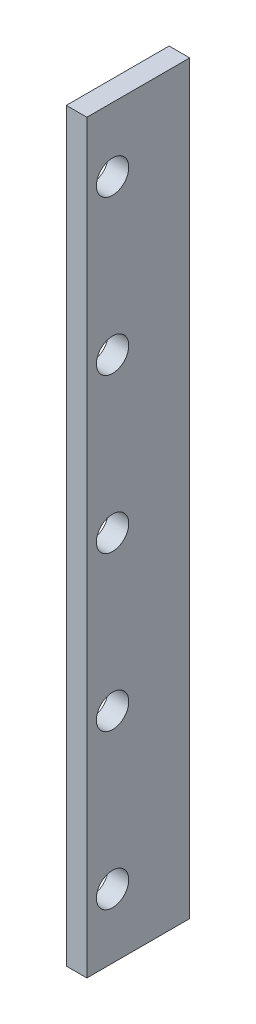
ISO-10303-21;
HEADER;
FILE_DESCRIPTION(('STEP AP214'),'2;1');
FILE_NAME('part.step','',(''),(''),'','','');
FILE_SCHEMA(('AUTOMOTIVE_DESIGN { 1 0 10303 214 1 1 1 1 }'));
ENDSEC;
DATA;
#1=APPLICATION_CONTEXT('core data for automotive mechanical design processes');
#2=APPLICATION_PROTOCOL_DEFINITION('international standard','automotive_design',2000,#1);
#3=PRODUCT_CONTEXT('',#1,'mechanical');
#4=PRODUCT('Part','Part','',(#3));
#5=PRODUCT_RELATED_PRODUCT_CATEGORY('part','',(#4));
#6=PRODUCT_DEFINITION_FORMATION('','',#4);
#7=PRODUCT_DEFINITION_CONTEXT('part definition',#1,'design');
#8=PRODUCT_DEFINITION('design','',#6,#7);
#9=PRODUCT_DEFINITION_SHAPE('','',#8);
#10=(LENGTH_UNIT() NAMED_UNIT(*) SI_UNIT(.MILLI.,.METRE.));
#11=(NAMED_UNIT(*) PLANE_ANGLE_UNIT() SI_UNIT($,.RADIAN.));
#12=(NAMED_UNIT(*) SI_UNIT($,.STERADIAN.) SOLID_ANGLE_UNIT());
#13=UNCERTAINTY_MEASURE_WITH_UNIT(LENGTH_MEASURE(1.E-05),#10,'distance_accuracy_value','');
#14=(GEOMETRIC_REPRESENTATION_CONTEXT(3) GLOBAL_UNCERTAINTY_ASSIGNED_CONTEXT((#13)) GLOBAL_UNIT_ASSIGNED_CONTEXT((#10,
#11,#12)) REPRESENTATION_CONTEXT('',''));
#15=CARTESIAN_POINT('',(0.,0.,0.));
#16=DIRECTION('',(0.,0.,1.));
#17=DIRECTION('',(1.,0.,0.));
#18=AXIS2_PLACEMENT_3D('',#15,#16,#17);
#19=CARTESIAN_POINT('',(0.,580.,-80.));
#20=DIRECTION('',(1.,0.,0.));
#21=DIRECTION('',(0.,0.,-1.));
#22=AXIS2_PLACEMENT_3D('',#19,#20,#21);
#23=PLANE('',#22);
#24=CARTESIAN_POINT('',(0.,530.,-20.0000000000017));
#25=DIRECTION('',(-1.,0.,0.));
#26=DIRECTION('',(0.,0.,1.));
#27=AXIS2_PLACEMENT_3D('',#24,#25,#26);
#28=CIRCLE('',#27,12.6);
#29=CARTESIAN_POINT('',(0.,530.,-7.40000000000167));
#30=VERTEX_POINT('',#29);
#31=EDGE_CURVE('E144',#30,#30,#28,.T.);
#32=ORIENTED_EDGE('',*,*,#31,.F.);
#33=EDGE_LOOP('',(#32));
#34=FACE_BOUND('',#33,.T.);
#35=CARTESIAN_POINT('',(0.,410.,-20.0000000000012));
#36=DIRECTION('',(-1.,0.,0.));
#37=DIRECTION('',(0.,0.,1.));
#38=AXIS2_PLACEMENT_3D('',#35,#36,#37);
#39=CIRCLE('',#38,12.6);
#40=CARTESIAN_POINT('',(0.,410.,-7.40000000000124));
#41=VERTEX_POINT('',#40);
#42=EDGE_CURVE('E152',#41,#41,#39,.T.);
#43=ORIENTED_EDGE('',*,*,#42,.F.);
#44=EDGE_LOOP('',(#43));
#45=FACE_BOUND('',#44,.T.);
#46=CARTESIAN_POINT('',(0.,290.,-20.0000000000008));
#47=DIRECTION('',(-1.,0.,0.));
#48=DIRECTION('',(0.,0.,1.));
#49=AXIS2_PLACEMENT_3D('',#46,#47,#48);
#50=CIRCLE('',#49,12.6);
#51=CARTESIAN_POINT('',(0.,290.,-7.40000000000083));
#52=VERTEX_POINT('',#51);
#53=EDGE_CURVE('E160',#52,#52,#50,.T.);
#54=ORIENTED_EDGE('',*,*,#53,.F.);
#55=EDGE_LOOP('',(#54));
#56=FACE_BOUND('',#55,.T.);
#57=CARTESIAN_POINT('',(0.,50.,-20.));
#58=DIRECTION('',(-1.,0.,0.));
#59=DIRECTION('',(0.,0.,1.));
#60=AXIS2_PLACEMENT_3D('',#57,#58,#59);
#61=CIRCLE('',#60,12.6);
#62=CARTESIAN_POINT('',(0.,50.,-7.40000000000001));
#63=VERTEX_POINT('',#62);
#64=EDGE_CURVE('E136',#63,#63,#61,.T.);
#65=ORIENTED_EDGE('',*,*,#64,.F.);
#66=EDGE_LOOP('',(#65));
#67=FACE_BOUND('',#66,.T.);
#68=CARTESIAN_POINT('',(0.,170.,-20.0000000000004));
#69=DIRECTION('',(-1.,0.,0.));
#70=DIRECTION('',(0.,0.,1.));
#71=AXIS2_PLACEMENT_3D('',#68,#69,#70);
#72=CIRCLE('',#71,12.6);
#73=CARTESIAN_POINT('',(0.,170.,-7.40000000000042));
#74=VERTEX_POINT('',#73);
#75=EDGE_CURVE('E132',#74,#74,#72,.T.);
#76=ORIENTED_EDGE('',*,*,#75,.F.);
#77=EDGE_LOOP('',(#76));
#78=FACE_BOUND('',#77,.T.);
#79=DIRECTION('',(0.,0.,1.));
#80=VECTOR('',#79,1.);
#81=CARTESIAN_POINT('',(0.,0.,-80.));
#82=LINE('',#81,#80);
#83=CARTESIAN_POINT('',(0.,0.,-80.));
#84=VERTEX_POINT('',#83);
#85=CARTESIAN_POINT('',(0.,0.,0.));
#86=VERTEX_POINT('',#85);
#87=EDGE_CURVE('E111',#84,#86,#82,.T.);
#88=ORIENTED_EDGE('',*,*,#87,.T.);
#89=DIRECTION('',(0.,-1.,0.));
#90=VECTOR('',#89,1.);
#91=CARTESIAN_POINT('',(0.,580.,0.));
#92=LINE('',#91,#90);
#93=CARTESIAN_POINT('',(0.,580.,0.));
#94=VERTEX_POINT('',#93);
#95=EDGE_CURVE('E11',#94,#86,#92,.T.);
#96=ORIENTED_EDGE('',*,*,#95,.F.);
#97=DIRECTION('',(0.,0.,1.));
#98=VECTOR('',#97,1.);
#99=CARTESIAN_POINT('',(0.,580.,-80.));
#100=LINE('',#99,#98);
#101=CARTESIAN_POINT('',(0.,580.,-80.));
#102=VERTEX_POINT('',#101);
#103=EDGE_CURVE('E95',#102,#94,#100,.T.);
#104=ORIENTED_EDGE('',*,*,#103,.F.);
#105=DIRECTION('',(0.,-1.,0.));
#106=VECTOR('',#105,1.);
#107=CARTESIAN_POINT('',(0.,580.,-80.));
#108=LINE('',#107,#106);
#109=EDGE_CURVE('E107',#102,#84,#108,.T.);
#110=ORIENTED_EDGE('',*,*,#109,.T.);
#111=EDGE_LOOP('',(#88,#96,#104,#110));
#112=FACE_BOUND('',#111,.T.);
#113=ADVANCED_FACE('F43',(#34,#45,#56,#67,#78,#112),#23,.F.);
#114=CARTESIAN_POINT('',(0.,580.,0.));
#115=DIRECTION('',(0.,0.,-1.));
#116=DIRECTION('',(-1.,0.,0.));
#117=AXIS2_PLACEMENT_3D('',#114,#115,#116);
#118=PLANE('',#117);
#119=DIRECTION('',(1.,0.,0.));
#120=VECTOR('',#119,1.);
#121=CARTESIAN_POINT('',(0.,0.,0.));
#122=LINE('',#121,#120);
#123=CARTESIAN_POINT('',(16.,0.,0.));
#124=VERTEX_POINT('',#123);
#125=EDGE_CURVE('E100',#86,#124,#122,.T.);
#126=ORIENTED_EDGE('',*,*,#125,.T.);
#127=DIRECTION('',(0.,-1.,0.));
#128=VECTOR('',#127,1.);
#129=CARTESIAN_POINT('',(16.,580.,0.));
#130=LINE('',#129,#128);
#131=CARTESIAN_POINT('',(16.,580.,0.));
#132=VERTEX_POINT('',#131);
#133=EDGE_CURVE('E52',#132,#124,#130,.T.);
#134=ORIENTED_EDGE('',*,*,#133,.F.);
#135=DIRECTION('',(1.,0.,0.));
#136=VECTOR('',#135,1.);
#137=CARTESIAN_POINT('',(0.,580.,0.));
#138=LINE('',#137,#136);
#139=EDGE_CURVE('E90',#94,#132,#138,.T.);
#140=ORIENTED_EDGE('',*,*,#139,.F.);
#141=ORIENTED_EDGE('',*,*,#95,.T.);
#142=EDGE_LOOP('',(#126,#134,#140,#141));
#143=FACE_BOUND('',#142,.T.);
#144=ADVANCED_FACE('F99',(#143),#118,.F.);
#145=CARTESIAN_POINT('',(16.,580.,0.));
#146=DIRECTION('',(-1.,0.,0.));
#147=DIRECTION('',(0.,0.,1.));
#148=AXIS2_PLACEMENT_3D('',#145,#146,#147);
#149=PLANE('',#148);
#150=CARTESIAN_POINT('',(16.,530.,-20.0000000000017));
#151=DIRECTION('',(-1.,0.,0.));
#152=DIRECTION('',(0.,0.,1.));
#153=AXIS2_PLACEMENT_3D('',#150,#151,#152);
#154=CIRCLE('',#153,12.6);
#155=CARTESIAN_POINT('',(16.,530.,-7.40000000000167));
#156=VERTEX_POINT('',#155);
#157=EDGE_CURVE('E140',#156,#156,#154,.T.);
#158=ORIENTED_EDGE('',*,*,#157,.T.);
#159=EDGE_LOOP('',(#158));
#160=FACE_BOUND('',#159,.T.);
#161=CARTESIAN_POINT('',(16.,410.,-20.0000000000012));
#162=DIRECTION('',(-1.,0.,0.));
#163=DIRECTION('',(0.,0.,1.));
#164=AXIS2_PLACEMENT_3D('',#161,#162,#163);
#165=CIRCLE('',#164,12.6);
#166=CARTESIAN_POINT('',(16.,410.,-7.40000000000124));
#167=VERTEX_POINT('',#166);
#168=EDGE_CURVE('E148',#167,#167,#165,.T.);
#169=ORIENTED_EDGE('',*,*,#168,.T.);
#170=EDGE_LOOP('',(#169));
#171=FACE_BOUND('',#170,.T.);
#172=CARTESIAN_POINT('',(16.,290.,-20.0000000000008));
#173=DIRECTION('',(-1.,0.,0.));
#174=DIRECTION('',(0.,0.,1.));
#175=AXIS2_PLACEMENT_3D('',#172,#173,#174);
#176=CIRCLE('',#175,12.6);
#177=CARTESIAN_POINT('',(16.,290.,-7.40000000000083));
#178=VERTEX_POINT('',#177);
#179=EDGE_CURVE('E156',#178,#178,#176,.T.);
#180=ORIENTED_EDGE('',*,*,#179,.T.);
#181=EDGE_LOOP('',(#180));
#182=FACE_BOUND('',#181,.T.);
#183=CARTESIAN_POINT('',(16.,50.,-20.));
#184=DIRECTION('',(-1.,0.,0.));
#185=DIRECTION('',(0.,0.,1.));
#186=AXIS2_PLACEMENT_3D('',#183,#184,#185);
#187=CIRCLE('',#186,12.6);
#188=CARTESIAN_POINT('',(16.,50.,-7.40000000000001));
#189=VERTEX_POINT('',#188);
#190=EDGE_CURVE('E164',#189,#189,#187,.T.);
#191=ORIENTED_EDGE('',*,*,#190,.T.);
#192=EDGE_LOOP('',(#191));
#193=FACE_BOUND('',#192,.T.);
#194=CARTESIAN_POINT('',(16.,170.,-20.0000000000004));
#195=DIRECTION('',(-1.,0.,0.));
#196=DIRECTION('',(0.,0.,1.));
#197=AXIS2_PLACEMENT_3D('',#194,#195,#196);
#198=CIRCLE('',#197,12.6);
#199=CARTESIAN_POINT('',(16.,170.,-7.40000000000042));
#200=VERTEX_POINT('',#199);
#201=EDGE_CURVE('E115',#200,#200,#198,.T.);
#202=ORIENTED_EDGE('',*,*,#201,.T.);
#203=EDGE_LOOP('',(#202));
#204=FACE_BOUND('',#203,.T.);
#205=DIRECTION('',(0.,0.,-1.));
#206=VECTOR('',#205,1.);
#207=CARTESIAN_POINT('',(16.,0.,0.));
#208=LINE('',#207,#206);
#209=CARTESIAN_POINT('',(16.,0.,-80.));
#210=VERTEX_POINT('',#209);
#211=EDGE_CURVE('E77',#124,#210,#208,.T.);
#212=ORIENTED_EDGE('',*,*,#211,.T.);
#213=DIRECTION('',(0.,-1.,0.));
#214=VECTOR('',#213,1.);
#215=CARTESIAN_POINT('',(16.,580.,-80.));
#216=LINE('',#215,#214);
#217=CARTESIAN_POINT('',(16.,580.,-80.));
#218=VERTEX_POINT('',#217);
#219=EDGE_CURVE('E102',#218,#210,#216,.T.);
#220=ORIENTED_EDGE('',*,*,#219,.F.);
#221=DIRECTION('',(0.,0.,-1.));
#222=VECTOR('',#221,1.);
#223=CARTESIAN_POINT('',(16.,580.,0.));
#224=LINE('',#223,#222);
#225=EDGE_CURVE('E93',#132,#218,#224,.T.);
#226=ORIENTED_EDGE('',*,*,#225,.F.);
#227=ORIENTED_EDGE('',*,*,#133,.T.);
#228=EDGE_LOOP('',(#212,#220,#226,#227));
#229=FACE_BOUND('',#228,.T.);
#230=ADVANCED_FACE('F103',(#160,#171,#182,#193,#204,#229),#149,.F.);
#231=CARTESIAN_POINT('',(16.,580.,-80.));
#232=DIRECTION('',(0.,0.,1.));
#233=DIRECTION('',(1.,0.,0.));
#234=AXIS2_PLACEMENT_3D('',#231,#232,#233);
#235=PLANE('',#234);
#236=DIRECTION('',(-1.,0.,0.));
#237=VECTOR('',#236,1.);
#238=CARTESIAN_POINT('',(16.,0.,-80.));
#239=LINE('',#238,#237);
#240=EDGE_CURVE('E83',#210,#84,#239,.T.);
#241=ORIENTED_EDGE('',*,*,#240,.T.);
#242=ORIENTED_EDGE('',*,*,#109,.F.);
#243=DIRECTION('',(-1.,0.,0.));
#244=VECTOR('',#243,1.);
#245=CARTESIAN_POINT('',(16.,580.,-80.));
#246=LINE('',#245,#244);
#247=EDGE_CURVE('E60',#218,#102,#246,.T.);
#248=ORIENTED_EDGE('',*,*,#247,.F.);
#249=ORIENTED_EDGE('',*,*,#219,.T.);
#250=EDGE_LOOP('',(#241,#242,#248,#249));
#251=FACE_BOUND('',#250,.T.);
#252=ADVANCED_FACE('F125',(#251),#235,.F.);
#253=CARTESIAN_POINT('',(0.,580.,0.));
#254=DIRECTION('',(0.,1.,0.));
#255=DIRECTION('',(0.,0.,1.));
#256=AXIS2_PLACEMENT_3D('',#253,#254,#255);
#257=PLANE('',#256);
#258=ORIENTED_EDGE('',*,*,#103,.T.);
#259=ORIENTED_EDGE('',*,*,#139,.T.);
#260=ORIENTED_EDGE('',*,*,#225,.T.);
#261=ORIENTED_EDGE('',*,*,#247,.T.);
#262=EDGE_LOOP('',(#258,#259,#260,#261));
#263=FACE_BOUND('',#262,.T.);
#264=ADVANCED_FACE('F91',(#263),#257,.T.);
#265=CARTESIAN_POINT('',(0.,0.,0.));
#266=DIRECTION('',(0.,1.,0.));
#267=DIRECTION('',(0.,0.,1.));
#268=AXIS2_PLACEMENT_3D('',#265,#266,#267);
#269=PLANE('',#268);
#270=ORIENTED_EDGE('',*,*,#87,.F.);
#271=ORIENTED_EDGE('',*,*,#240,.F.);
#272=ORIENTED_EDGE('',*,*,#211,.F.);
#273=ORIENTED_EDGE('',*,*,#125,.F.);
#274=EDGE_LOOP('',(#270,#271,#272,#273));
#275=FACE_BOUND('',#274,.T.);
#276=ADVANCED_FACE('F128',(#275),#269,.F.);
#277=CARTESIAN_POINT('',(16.,170.,-20.0000000000004));
#278=DIRECTION('',(-1.,0.,0.));
#279=DIRECTION('',(0.,0.,1.));
#280=AXIS2_PLACEMENT_3D('',#277,#278,#279);
#281=CYLINDRICAL_SURFACE('',#280,12.6);
#282=ORIENTED_EDGE('',*,*,#201,.F.);
#283=EDGE_LOOP('',(#282));
#284=FACE_BOUND('',#283,.T.);
#285=ORIENTED_EDGE('',*,*,#75,.T.);
#286=EDGE_LOOP('',(#285));
#287=FACE_BOUND('',#286,.T.);
#288=ADVANCED_FACE('F179',(#284,#287),#281,.F.);
#289=CARTESIAN_POINT('',(16.,50.,-20.));
#290=DIRECTION('',(-1.,0.,0.));
#291=DIRECTION('',(0.,0.,1.));
#292=AXIS2_PLACEMENT_3D('',#289,#290,#291);
#293=CYLINDRICAL_SURFACE('',#292,12.6);
#294=ORIENTED_EDGE('',*,*,#190,.F.);
#295=EDGE_LOOP('',(#294));
#296=FACE_BOUND('',#295,.T.);
#297=ORIENTED_EDGE('',*,*,#64,.T.);
#298=EDGE_LOOP('',(#297));
#299=FACE_BOUND('',#298,.T.);
#300=ADVANCED_FACE('F172',(#296,#299),#293,.F.);
#301=CARTESIAN_POINT('',(16.,290.,-20.0000000000008));
#302=DIRECTION('',(-1.,0.,0.));
#303=DIRECTION('',(0.,0.,1.));
#304=AXIS2_PLACEMENT_3D('',#301,#302,#303);
#305=CYLINDRICAL_SURFACE('',#304,12.6);
#306=ORIENTED_EDGE('',*,*,#179,.F.);
#307=EDGE_LOOP('',(#306));
#308=FACE_BOUND('',#307,.T.);
#309=ORIENTED_EDGE('',*,*,#53,.T.);
#310=EDGE_LOOP('',(#309));
#311=FACE_BOUND('',#310,.T.);
#312=ADVANCED_FACE('F187',(#308,#311),#305,.F.);
#313=CARTESIAN_POINT('',(16.,410.,-20.0000000000012));
#314=DIRECTION('',(-1.,0.,0.));
#315=DIRECTION('',(0.,0.,1.));
#316=AXIS2_PLACEMENT_3D('',#313,#314,#315);
#317=CYLINDRICAL_SURFACE('',#316,12.6);
#318=ORIENTED_EDGE('',*,*,#168,.F.);
#319=EDGE_LOOP('',(#318));
#320=FACE_BOUND('',#319,.T.);
#321=ORIENTED_EDGE('',*,*,#42,.T.);
#322=EDGE_LOOP('',(#321));
#323=FACE_BOUND('',#322,.T.);
#324=ADVANCED_FACE('F267',(#320,#323),#317,.F.);
#325=CARTESIAN_POINT('',(16.,530.,-20.0000000000017));
#326=DIRECTION('',(-1.,0.,0.));
#327=DIRECTION('',(0.,0.,1.));
#328=AXIS2_PLACEMENT_3D('',#325,#326,#327);
#329=CYLINDRICAL_SURFACE('',#328,12.6);
#330=ORIENTED_EDGE('',*,*,#157,.F.);
#331=EDGE_LOOP('',(#330));
#332=FACE_BOUND('',#331,.T.);
#333=ORIENTED_EDGE('',*,*,#31,.T.);
#334=EDGE_LOOP('',(#333));
#335=FACE_BOUND('',#334,.T.);
#336=ADVANCED_FACE('F194',(#332,#335),#329,.F.);
#337=CLOSED_SHELL('',(#113,#144,#230,#252,#264,#276,#288,#300,#312,#324,#336));
#338=MANIFOLD_SOLID_BREP('B2',#337);
#339=ADVANCED_BREP_SHAPE_REPRESENTATION('',(#18,#338),#14);
#340=SHAPE_DEFINITION_REPRESENTATION(#9,#339);
ENDSEC;
END-ISO-10303-21;
